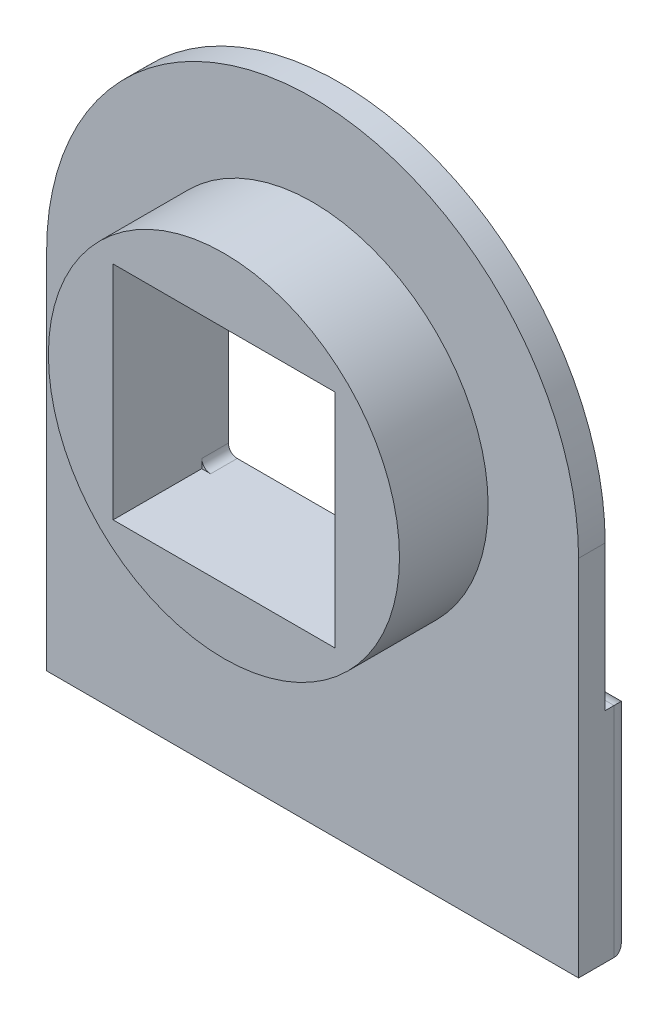
ISO-10303-21;
HEADER;
FILE_DESCRIPTION(('STEP AP214'),'2;1');
FILE_NAME('part.step','',(''),(''),'','','');
FILE_SCHEMA(('AUTOMOTIVE_DESIGN { 1 0 10303 214 1 1 1 1 }'));
ENDSEC;
DATA;
#1=APPLICATION_CONTEXT('core data for automotive mechanical design processes');
#2=APPLICATION_PROTOCOL_DEFINITION('international standard','automotive_design',2000,#1);
#3=PRODUCT_CONTEXT('',#1,'mechanical');
#4=PRODUCT('Part','Part','',(#3));
#5=PRODUCT_RELATED_PRODUCT_CATEGORY('part','',(#4));
#6=PRODUCT_DEFINITION_FORMATION('','',#4);
#7=PRODUCT_DEFINITION_CONTEXT('part definition',#1,'design');
#8=PRODUCT_DEFINITION('design','',#6,#7);
#9=PRODUCT_DEFINITION_SHAPE('','',#8);
#10=(LENGTH_UNIT() NAMED_UNIT(*) SI_UNIT(.MILLI.,.METRE.));
#11=(NAMED_UNIT(*) PLANE_ANGLE_UNIT() SI_UNIT($,.RADIAN.));
#12=(NAMED_UNIT(*) SI_UNIT($,.STERADIAN.) SOLID_ANGLE_UNIT());
#13=UNCERTAINTY_MEASURE_WITH_UNIT(LENGTH_MEASURE(1.E-05),#10,'distance_accuracy_value','');
#14=(GEOMETRIC_REPRESENTATION_CONTEXT(3) GLOBAL_UNCERTAINTY_ASSIGNED_CONTEXT((#13)) GLOBAL_UNIT_ASSIGNED_CONTEXT((#10,
#11,#12)) REPRESENTATION_CONTEXT('',''));
#15=CARTESIAN_POINT('',(0.,0.,0.));
#16=DIRECTION('',(0.,0.,1.));
#17=DIRECTION('',(1.,0.,0.));
#18=AXIS2_PLACEMENT_3D('',#15,#16,#17);
#19=CARTESIAN_POINT('',(0.,0.,0.));
#20=DIRECTION('',(0.,0.,1.));
#21=DIRECTION('',(1.,0.,0.));
#22=AXIS2_PLACEMENT_3D('',#19,#20,#21);
#23=PLANE('',#22);
#24=CARTESIAN_POINT('',(-20.3392574501485,-11.208047119268,0.));
#25=DIRECTION('',(0.,0.,1.));
#26=DIRECTION('',(1.,0.,0.));
#27=AXIS2_PLACEMENT_3D('',#24,#25,#26);
#28=CIRCLE('',#27,1.82171701222499);
#29=CARTESIAN_POINT('',(-18.5175404379235,-11.208047119268,0.));
#30=VERTEX_POINT('',#29);
#31=EDGE_CURVE('E204',#30,#30,#28,.T.);
#32=ORIENTED_EDGE('',*,*,#31,.T.);
#33=EDGE_LOOP('',(#32));
#34=FACE_BOUND('',#33,.T.);
#35=DIRECTION('',(1.,0.,0.));
#36=VECTOR('',#35,1.);
#37=CARTESIAN_POINT('',(0.,-12.5,0.));
#38=LINE('',#37,#36);
#39=CARTESIAN_POINT('',(-11.5,-12.5,0.));
#40=VERTEX_POINT('',#39);
#41=CARTESIAN_POINT('',(11.5,-12.5,0.));
#42=VERTEX_POINT('',#41);
#43=EDGE_CURVE('E299',#40,#42,#38,.T.);
#44=ORIENTED_EDGE('',*,*,#43,.T.);
#45=CARTESIAN_POINT('',(11.5,-11.5,0.));
#46=DIRECTION('',(0.,0.,-1.));
#47=DIRECTION('',(-1.,0.,0.));
#48=AXIS2_PLACEMENT_3D('',#45,#46,#47);
#49=CIRCLE('',#48,1.);
#50=CARTESIAN_POINT('',(12.5,-11.5,0.));
#51=VERTEX_POINT('',#50);
#52=EDGE_CURVE('E207',#42,#51,#49,.F.);
#53=ORIENTED_EDGE('',*,*,#52,.T.);
#54=DIRECTION('',(0.,1.,0.));
#55=VECTOR('',#54,1.);
#56=CARTESIAN_POINT('',(12.5,-12.5,0.));
#57=LINE('',#56,#55);
#58=CARTESIAN_POINT('',(12.5,11.5,0.));
#59=VERTEX_POINT('',#58);
#60=EDGE_CURVE('E302',#51,#59,#57,.T.);
#61=ORIENTED_EDGE('',*,*,#60,.T.);
#62=CARTESIAN_POINT('',(11.5,11.5,0.));
#63=DIRECTION('',(0.,0.,-1.));
#64=DIRECTION('',(-1.,0.,0.));
#65=AXIS2_PLACEMENT_3D('',#62,#63,#64);
#66=CIRCLE('',#65,0.999999999999999);
#67=CARTESIAN_POINT('',(11.5,12.5,0.));
#68=VERTEX_POINT('',#67);
#69=EDGE_CURVE('E232',#59,#68,#66,.F.);
#70=ORIENTED_EDGE('',*,*,#69,.T.);
#71=DIRECTION('',(-1.,0.,0.));
#72=VECTOR('',#71,1.);
#73=CARTESIAN_POINT('',(0.,12.5,0.));
#74=LINE('',#73,#72);
#75=CARTESIAN_POINT('',(-11.5,12.5,0.));
#76=VERTEX_POINT('',#75);
#77=EDGE_CURVE('E305',#68,#76,#74,.T.);
#78=ORIENTED_EDGE('',*,*,#77,.T.);
#79=CARTESIAN_POINT('',(-11.5,11.5,0.));
#80=DIRECTION('',(0.,0.,-1.));
#81=DIRECTION('',(-1.,0.,0.));
#82=AXIS2_PLACEMENT_3D('',#79,#80,#81);
#83=CIRCLE('',#82,1.);
#84=CARTESIAN_POINT('',(-12.5,11.5,0.));
#85=VERTEX_POINT('',#84);
#86=EDGE_CURVE('E234',#76,#85,#83,.F.);
#87=ORIENTED_EDGE('',*,*,#86,.T.);
#88=DIRECTION('',(0.,-1.,0.));
#89=VECTOR('',#88,1.);
#90=CARTESIAN_POINT('',(-12.5,12.5,0.));
#91=LINE('',#90,#89);
#92=CARTESIAN_POINT('',(-12.5,-11.5,0.));
#93=VERTEX_POINT('',#92);
#94=EDGE_CURVE('E291',#85,#93,#91,.T.);
#95=ORIENTED_EDGE('',*,*,#94,.T.);
#96=CARTESIAN_POINT('',(-11.5,-11.5,0.));
#97=DIRECTION('',(0.,0.,-1.));
#98=DIRECTION('',(-1.,0.,0.));
#99=AXIS2_PLACEMENT_3D('',#96,#97,#98);
#100=CIRCLE('',#99,0.999999999999999);
#101=EDGE_CURVE('E236',#40,#93,#100,.T.);
#102=ORIENTED_EDGE('',*,*,#101,.F.);
#103=EDGE_LOOP('',(#44,#53,#61,#70,#78,#87,#95,#102));
#104=FACE_BOUND('',#103,.T.);
#105=DIRECTION('',(1.,0.,0.));
#106=VECTOR('',#105,1.);
#107=CARTESIAN_POINT('',(30.,-16.3815795480247,0.));
#108=LINE('',#107,#106);
#109=CARTESIAN_POINT('',(-30.,-16.3815795480247,0.));
#110=VERTEX_POINT('',#109);
#111=CARTESIAN_POINT('',(30.,-16.3815795480247,0.));
#112=VERTEX_POINT('',#111);
#113=EDGE_CURVE('E188',#110,#112,#108,.T.);
#114=ORIENTED_EDGE('',*,*,#113,.F.);
#115=DIRECTION('',(0.,1.,0.));
#116=VECTOR('',#115,1.);
#117=CARTESIAN_POINT('',(-30.,0.,0.));
#118=LINE('',#117,#116);
#119=CARTESIAN_POINT('',(-30.,0.,0.));
#120=VERTEX_POINT('',#119);
#121=EDGE_CURVE('E196',#110,#120,#118,.T.);
#122=ORIENTED_EDGE('',*,*,#121,.T.);
#123=CARTESIAN_POINT('',(0.,0.,0.));
#124=DIRECTION('',(0.,0.,-1.));
#125=DIRECTION('',(-1.,0.,0.));
#126=AXIS2_PLACEMENT_3D('',#123,#124,#125);
#127=CIRCLE('',#126,30.);
#128=CARTESIAN_POINT('',(30.,0.,0.));
#129=VERTEX_POINT('',#128);
#130=EDGE_CURVE('E195',#120,#129,#127,.T.);
#131=ORIENTED_EDGE('',*,*,#130,.T.);
#132=DIRECTION('',(0.,1.,0.));
#133=VECTOR('',#132,1.);
#134=CARTESIAN_POINT('',(30.,0.,0.));
#135=LINE('',#134,#133);
#136=EDGE_CURVE('E180',#112,#129,#135,.T.);
#137=ORIENTED_EDGE('',*,*,#136,.F.);
#138=EDGE_LOOP('',(#114,#122,#131,#137));
#139=FACE_BOUND('',#138,.T.);
#140=ADVANCED_FACE('F39',(#34,#104,#139),#23,.F.);
#141=CARTESIAN_POINT('',(0.,0.,13.));
#142=DIRECTION('',(0.,0.,-1.));
#143=DIRECTION('',(-1.,0.,0.));
#144=AXIS2_PLACEMENT_3D('',#141,#142,#143);
#145=CYLINDRICAL_SURFACE('',#144,19.8);
#146=CARTESIAN_POINT('',(0.,0.,13.));
#147=DIRECTION('',(0.,0.,1.));
#148=DIRECTION('',(1.,0.,0.));
#149=AXIS2_PLACEMENT_3D('',#146,#147,#148);
#150=CIRCLE('',#149,19.8);
#151=CARTESIAN_POINT('',(-19.8,0.,13.));
#152=VERTEX_POINT('',#151);
#153=EDGE_CURVE('E321',#152,#152,#150,.T.);
#154=CARTESIAN_POINT('',(0.,0.,3.));
#155=DIRECTION('',(0.,0.,-1.));
#156=DIRECTION('',(-1.,0.,0.));
#157=AXIS2_PLACEMENT_3D('',#154,#155,#156);
#158=CIRCLE('',#157,19.8);
#159=CARTESIAN_POINT('',(-19.8,0.,3.));
#160=VERTEX_POINT('',#159);
#161=EDGE_CURVE('E283',#160,#160,#158,.T.);
#162=CARTESIAN_POINT('',(-19.8,0.,13.));
#163=CARTESIAN_POINT('',(-19.8,0.,12.8958333333333));
#164=CARTESIAN_POINT('',(-19.8,0.,12.7916666666667));
#165=CARTESIAN_POINT('',(-19.8,0.,12.5833333333333));
#166=CARTESIAN_POINT('',(-19.8,0.,12.4791666666667));
#167=CARTESIAN_POINT('',(-19.8,0.,12.2708333333333));
#168=CARTESIAN_POINT('',(-19.8,0.,12.1666666666667));
#169=CARTESIAN_POINT('',(-19.8,0.,11.9583333333333));
#170=CARTESIAN_POINT('',(-19.8,0.,11.8541666666667));
#171=CARTESIAN_POINT('',(-19.8,0.,11.6458333333333));
#172=CARTESIAN_POINT('',(-19.8,0.,11.5416666666667));
#173=CARTESIAN_POINT('',(-19.8,0.,11.3333333333333));
#174=CARTESIAN_POINT('',(-19.8,0.,11.2291666666667));
#175=CARTESIAN_POINT('',(-19.8,0.,11.0208333333333));
#176=CARTESIAN_POINT('',(-19.8,0.,10.9166666666667));
#177=CARTESIAN_POINT('',(-19.8,0.,10.7083333333333));
#178=CARTESIAN_POINT('',(-19.8,0.,10.6041666666667));
#179=CARTESIAN_POINT('',(-19.8,0.,10.3958333333333));
#180=CARTESIAN_POINT('',(-19.8,0.,10.2916666666667));
#181=CARTESIAN_POINT('',(-19.8,0.,10.0833333333333));
#182=CARTESIAN_POINT('',(-19.8,0.,9.97916666666667));
#183=CARTESIAN_POINT('',(-19.8,0.,9.77083333333333));
#184=CARTESIAN_POINT('',(-19.8,0.,9.66666666666667));
#185=CARTESIAN_POINT('',(-19.8,0.,9.45833333333333));
#186=CARTESIAN_POINT('',(-19.8,0.,9.35416666666667));
#187=CARTESIAN_POINT('',(-19.8,0.,9.14583333333333));
#188=CARTESIAN_POINT('',(-19.8,0.,9.04166666666667));
#189=CARTESIAN_POINT('',(-19.8,0.,8.83333333333333));
#190=CARTESIAN_POINT('',(-19.8,0.,8.72916666666667));
#191=CARTESIAN_POINT('',(-19.8,0.,8.52083333333333));
#192=CARTESIAN_POINT('',(-19.8,0.,8.41666666666667));
#193=CARTESIAN_POINT('',(-19.8,0.,8.20833333333333));
#194=CARTESIAN_POINT('',(-19.8,0.,8.10416666666667));
#195=CARTESIAN_POINT('',(-19.8,0.,7.89583333333333));
#196=CARTESIAN_POINT('',(-19.8,0.,7.79166666666667));
#197=CARTESIAN_POINT('',(-19.8,0.,7.58333333333333));
#198=CARTESIAN_POINT('',(-19.8,0.,7.47916666666667));
#199=CARTESIAN_POINT('',(-19.8,0.,7.27083333333333));
#200=CARTESIAN_POINT('',(-19.8,0.,7.16666666666667));
#201=CARTESIAN_POINT('',(-19.8,0.,6.95833333333333));
#202=CARTESIAN_POINT('',(-19.8,0.,6.85416666666667));
#203=CARTESIAN_POINT('',(-19.8,0.,6.64583333333333));
#204=CARTESIAN_POINT('',(-19.8,0.,6.54166666666667));
#205=CARTESIAN_POINT('',(-19.8,0.,6.33333333333333));
#206=CARTESIAN_POINT('',(-19.8,0.,6.22916666666667));
#207=CARTESIAN_POINT('',(-19.8,0.,6.02083333333333));
#208=CARTESIAN_POINT('',(-19.8,0.,5.91666666666667));
#209=CARTESIAN_POINT('',(-19.8,0.,5.70833333333333));
#210=CARTESIAN_POINT('',(-19.8,0.,5.60416666666667));
#211=CARTESIAN_POINT('',(-19.8,0.,5.39583333333333));
#212=CARTESIAN_POINT('',(-19.8,0.,5.29166666666667));
#213=CARTESIAN_POINT('',(-19.8,0.,5.08333333333333));
#214=CARTESIAN_POINT('',(-19.8,0.,4.97916666666667));
#215=CARTESIAN_POINT('',(-19.8,0.,4.77083333333334));
#216=CARTESIAN_POINT('',(-19.8,0.,4.66666666666667));
#217=CARTESIAN_POINT('',(-19.8,0.,4.45833333333334));
#218=CARTESIAN_POINT('',(-19.8,0.,4.35416666666667));
#219=CARTESIAN_POINT('',(-19.8,0.,4.14583333333334));
#220=CARTESIAN_POINT('',(-19.8,0.,4.04166666666667));
#221=CARTESIAN_POINT('',(-19.8,0.,3.83333333333334));
#222=CARTESIAN_POINT('',(-19.8,0.,3.72916666666667));
#223=CARTESIAN_POINT('',(-19.8,0.,3.52083333333334));
#224=CARTESIAN_POINT('',(-19.8,0.,3.41666666666667));
#225=CARTESIAN_POINT('',(-19.8,0.,3.20833333333334));
#226=CARTESIAN_POINT('',(-19.8,0.,3.10416666666667));
#227=CARTESIAN_POINT('',(-19.8,0.,3.));
#228=B_SPLINE_CURVE_WITH_KNOTS('',3,(#162,#163,#164,#165,#166,#167,#168,#169,#170,#171,#172,
#173,#174,#175,#176,#177,#178,#179,#180,#181,#182,#183,#184,#185,#186,#187,#188,#189,#190,#191,
#192,#193,#194,#195,#196,#197,#198,#199,#200,#201,#202,#203,#204,#205,#206,#207,#208,#209,#210,
#211,#212,#213,#214,#215,#216,#217,#218,#219,#220,#221,#222,#223,#224,#225,#226,#227),
.UNSPECIFIED.,.F.,.F.,(4,2,2,2,2,2,2,2,2,2,2,2,2,2,2,2,2,2,2,2,2,2,2,2,2,2,2,2,2,2,2,2,4),(0.,
0.3125,0.625000000000001,0.937500000000001,1.25,1.5625,1.875,2.1875,2.5,2.8125,3.125,3.4375,
3.75,4.0625,4.375,4.6875,5.,5.3125,5.625,5.9375,6.25,6.5625,6.875,7.1875,7.5,7.8125,8.125,
8.4375,8.75,9.0625,9.375,9.6875,10.),.UNSPECIFIED.);
#229=EDGE_CURVE('BSEAM379',#152,#160,#228,.T.);
#230=ORIENTED_EDGE('',*,*,#153,.F.);
#231=ORIENTED_EDGE('',*,*,#161,.F.);
#232=ORIENTED_EDGE('',*,*,#229,.T.);
#233=ORIENTED_EDGE('',*,*,#229,.F.);
#234=EDGE_LOOP('',(#230,#232,#231,#233));
#235=FACE_BOUND('',#234,.T.);
#236=ADVANCED_FACE('F379',(#235),#145,.T.);
#237=CARTESIAN_POINT('',(12.5,-12.5,13.));
#238=DIRECTION('',(-1.,0.,0.));
#239=DIRECTION('',(0.,0.,1.));
#240=AXIS2_PLACEMENT_3D('',#237,#238,#239);
#241=PLANE('',#240);
#242=DIRECTION('',(0.,0.,-1.));
#243=VECTOR('',#242,1.);
#244=CARTESIAN_POINT('',(12.5,12.5,13.));
#245=LINE('',#244,#243);
#246=CARTESIAN_POINT('',(12.5,12.5,13.));
#247=VERTEX_POINT('',#246);
#248=CARTESIAN_POINT('',(12.5,12.5,3.));
#249=VERTEX_POINT('',#248);
#250=EDGE_CURVE('E315',#247,#249,#245,.T.);
#251=ORIENTED_EDGE('',*,*,#250,.T.);
#252=DIRECTION('',(0.,-1.,0.));
#253=VECTOR('',#252,1.);
#254=CARTESIAN_POINT('',(12.5,-12.5,3.));
#255=LINE('',#254,#253);
#256=CARTESIAN_POINT('',(12.5,11.5,3.));
#257=VERTEX_POINT('',#256);
#258=EDGE_CURVE('E279',#249,#257,#255,.T.);
#259=ORIENTED_EDGE('',*,*,#258,.T.);
#260=DIRECTION('',(0.,0.,-1.));
#261=VECTOR('',#260,1.);
#262=CARTESIAN_POINT('',(12.5,11.5,3.));
#263=LINE('',#262,#261);
#264=EDGE_CURVE('E267',#257,#59,#263,.T.);
#265=ORIENTED_EDGE('',*,*,#264,.T.);
#266=ORIENTED_EDGE('',*,*,#60,.F.);
#267=DIRECTION('',(0.,0.,-1.));
#268=VECTOR('',#267,1.);
#269=CARTESIAN_POINT('',(12.5,-11.5,3.));
#270=LINE('',#269,#268);
#271=CARTESIAN_POINT('',(12.5,-11.5,3.));
#272=VERTEX_POINT('',#271);
#273=EDGE_CURVE('E230',#272,#51,#270,.T.);
#274=ORIENTED_EDGE('',*,*,#273,.F.);
#275=CARTESIAN_POINT('',(12.5,-12.5,3.));
#276=VERTEX_POINT('',#275);
#277=EDGE_CURVE('E282',#272,#276,#255,.T.);
#278=ORIENTED_EDGE('',*,*,#277,.T.);
#279=DIRECTION('',(0.,0.,-1.));
#280=VECTOR('',#279,1.);
#281=CARTESIAN_POINT('',(12.5,-12.5,13.));
#282=LINE('',#281,#280);
#283=CARTESIAN_POINT('',(12.5,-12.5,13.));
#284=VERTEX_POINT('',#283);
#285=EDGE_CURVE('E318',#284,#276,#282,.T.);
#286=ORIENTED_EDGE('',*,*,#285,.F.);
#287=DIRECTION('',(0.,1.,0.));
#288=VECTOR('',#287,1.);
#289=CARTESIAN_POINT('',(12.5,-12.5,13.));
#290=LINE('',#289,#288);
#291=EDGE_CURVE('E290',#284,#247,#290,.T.);
#292=ORIENTED_EDGE('',*,*,#291,.T.);
#293=EDGE_LOOP('',(#251,#259,#265,#266,#274,#278,#286,#292));
#294=FACE_BOUND('',#293,.T.);
#295=ADVANCED_FACE('F385',(#294),#241,.T.);
#296=CARTESIAN_POINT('',(0.,12.5,13.));
#297=DIRECTION('',(0.,-1.,0.));
#298=DIRECTION('',(1.,0.,0.));
#299=AXIS2_PLACEMENT_3D('',#296,#297,#298);
#300=PLANE('',#299);
#301=DIRECTION('',(0.,0.,-1.));
#302=VECTOR('',#301,1.);
#303=CARTESIAN_POINT('',(-12.5,12.5,13.));
#304=LINE('',#303,#302);
#305=CARTESIAN_POINT('',(-12.5,12.5,13.));
#306=VERTEX_POINT('',#305);
#307=CARTESIAN_POINT('',(-12.5,12.5,3.));
#308=VERTEX_POINT('',#307);
#309=EDGE_CURVE('E312',#306,#308,#304,.T.);
#310=ORIENTED_EDGE('',*,*,#309,.T.);
#311=DIRECTION('',(1.,0.,0.));
#312=VECTOR('',#311,1.);
#313=CARTESIAN_POINT('',(0.,12.5,3.));
#314=LINE('',#313,#312);
#315=CARTESIAN_POINT('',(-11.5,12.5,3.));
#316=VERTEX_POINT('',#315);
#317=EDGE_CURVE('E243',#308,#316,#314,.T.);
#318=ORIENTED_EDGE('',*,*,#317,.T.);
#319=DIRECTION('',(0.,0.,-1.));
#320=VECTOR('',#319,1.);
#321=CARTESIAN_POINT('',(-11.5,12.5,3.));
#322=LINE('',#321,#320);
#323=EDGE_CURVE('E261',#316,#76,#322,.T.);
#324=ORIENTED_EDGE('',*,*,#323,.T.);
#325=ORIENTED_EDGE('',*,*,#77,.F.);
#326=DIRECTION('',(0.,0.,-1.));
#327=VECTOR('',#326,1.);
#328=CARTESIAN_POINT('',(11.5,12.5,3.));
#329=LINE('',#328,#327);
#330=CARTESIAN_POINT('',(11.5,12.5,3.));
#331=VERTEX_POINT('',#330);
#332=EDGE_CURVE('E264',#331,#68,#329,.T.);
#333=ORIENTED_EDGE('',*,*,#332,.F.);
#334=EDGE_CURVE('E275',#331,#249,#314,.T.);
#335=ORIENTED_EDGE('',*,*,#334,.T.);
#336=ORIENTED_EDGE('',*,*,#250,.F.);
#337=DIRECTION('',(-1.,0.,0.));
#338=VECTOR('',#337,1.);
#339=CARTESIAN_POINT('',(12.5,12.5,13.));
#340=LINE('',#339,#338);
#341=EDGE_CURVE('E293',#247,#306,#340,.T.);
#342=ORIENTED_EDGE('',*,*,#341,.T.);
#343=EDGE_LOOP('',(#310,#318,#324,#325,#333,#335,#336,#342));
#344=FACE_BOUND('',#343,.T.);
#345=ADVANCED_FACE('F471',(#344),#300,.T.);
#346=CARTESIAN_POINT('',(-12.5,12.5,13.));
#347=DIRECTION('',(1.,0.,0.));
#348=DIRECTION('',(0.,0.,-1.));
#349=AXIS2_PLACEMENT_3D('',#346,#347,#348);
#350=PLANE('',#349);
#351=DIRECTION('',(0.,0.,-1.));
#352=VECTOR('',#351,1.);
#353=CARTESIAN_POINT('',(-12.5,-12.5,13.));
#354=LINE('',#353,#352);
#355=CARTESIAN_POINT('',(-12.5,-12.5,13.));
#356=VERTEX_POINT('',#355);
#357=CARTESIAN_POINT('',(-12.5,-12.5,3.));
#358=VERTEX_POINT('',#357);
#359=EDGE_CURVE('E298',#356,#358,#354,.T.);
#360=ORIENTED_EDGE('',*,*,#359,.T.);
#361=DIRECTION('',(0.,1.,0.));
#362=VECTOR('',#361,1.);
#363=CARTESIAN_POINT('',(-12.5,12.5,3.));
#364=LINE('',#363,#362);
#365=CARTESIAN_POINT('',(-12.5,-11.5,3.));
#366=VERTEX_POINT('',#365);
#367=EDGE_CURVE('E287',#358,#366,#364,.T.);
#368=ORIENTED_EDGE('',*,*,#367,.T.);
#369=DIRECTION('',(0.,0.,-1.));
#370=VECTOR('',#369,1.);
#371=CARTESIAN_POINT('',(-12.5,-11.5,3.));
#372=LINE('',#371,#370);
#373=EDGE_CURVE('E255',#366,#93,#372,.T.);
#374=ORIENTED_EDGE('',*,*,#373,.T.);
#375=ORIENTED_EDGE('',*,*,#94,.F.);
#376=DIRECTION('',(0.,0.,-1.));
#377=VECTOR('',#376,1.);
#378=CARTESIAN_POINT('',(-12.5,11.5,3.));
#379=LINE('',#378,#377);
#380=CARTESIAN_POINT('',(-12.5,11.5,3.));
#381=VERTEX_POINT('',#380);
#382=EDGE_CURVE('E258',#381,#85,#379,.T.);
#383=ORIENTED_EDGE('',*,*,#382,.F.);
#384=EDGE_CURVE('E324',#381,#308,#364,.T.);
#385=ORIENTED_EDGE('',*,*,#384,.T.);
#386=ORIENTED_EDGE('',*,*,#309,.F.);
#387=DIRECTION('',(0.,-1.,0.));
#388=VECTOR('',#387,1.);
#389=CARTESIAN_POINT('',(-12.5,12.5,13.));
#390=LINE('',#389,#388);
#391=EDGE_CURVE('E296',#306,#356,#390,.T.);
#392=ORIENTED_EDGE('',*,*,#391,.T.);
#393=EDGE_LOOP('',(#360,#368,#374,#375,#383,#385,#386,#392));
#394=FACE_BOUND('',#393,.T.);
#395=ADVANCED_FACE('F483',(#394),#350,.T.);
#396=CARTESIAN_POINT('',(0.,0.,13.));
#397=DIRECTION('',(0.,0.,1.));
#398=DIRECTION('',(1.,0.,0.));
#399=AXIS2_PLACEMENT_3D('',#396,#397,#398);
#400=PLANE('',#399);
#401=ORIENTED_EDGE('',*,*,#153,.T.);
#402=EDGE_LOOP('',(#401));
#403=FACE_BOUND('',#402,.T.);
#404=ORIENTED_EDGE('',*,*,#291,.F.);
#405=DIRECTION('',(1.,0.,0.));
#406=VECTOR('',#405,1.);
#407=CARTESIAN_POINT('',(-12.5,-12.5,13.));
#408=LINE('',#407,#406);
#409=EDGE_CURVE('E288',#356,#284,#408,.T.);
#410=ORIENTED_EDGE('',*,*,#409,.F.);
#411=ORIENTED_EDGE('',*,*,#391,.F.);
#412=ORIENTED_EDGE('',*,*,#341,.F.);
#413=EDGE_LOOP('',(#404,#410,#411,#412));
#414=FACE_BOUND('',#413,.T.);
#415=ADVANCED_FACE('F391',(#403,#414),#400,.T.);
#416=CARTESIAN_POINT('',(0.,-12.5,13.));
#417=DIRECTION('',(0.,1.,0.));
#418=DIRECTION('',(0.,0.,1.));
#419=AXIS2_PLACEMENT_3D('',#416,#417,#418);
#420=PLANE('',#419);
#421=DIRECTION('',(0.,0.,-1.));
#422=VECTOR('',#421,1.);
#423=CARTESIAN_POINT('',(11.5,-12.5,3.));
#424=LINE('',#423,#422);
#425=CARTESIAN_POINT('',(11.5,-12.5,3.));
#426=VERTEX_POINT('',#425);
#427=EDGE_CURVE('E250',#426,#42,#424,.T.);
#428=ORIENTED_EDGE('',*,*,#427,.T.);
#429=ORIENTED_EDGE('',*,*,#43,.F.);
#430=DIRECTION('',(0.,0.,-1.));
#431=VECTOR('',#430,1.);
#432=CARTESIAN_POINT('',(-11.5,-12.5,3.));
#433=LINE('',#432,#431);
#434=CARTESIAN_POINT('',(-11.5,-12.5,3.));
#435=VERTEX_POINT('',#434);
#436=EDGE_CURVE('E253',#435,#40,#433,.T.);
#437=ORIENTED_EDGE('',*,*,#436,.F.);
#438=DIRECTION('',(-1.,0.,0.));
#439=VECTOR('',#438,1.);
#440=CARTESIAN_POINT('',(0.,-12.5,3.));
#441=LINE('',#440,#439);
#442=EDGE_CURVE('E274',#435,#358,#441,.T.);
#443=ORIENTED_EDGE('',*,*,#442,.T.);
#444=ORIENTED_EDGE('',*,*,#359,.F.);
#445=ORIENTED_EDGE('',*,*,#409,.T.);
#446=ORIENTED_EDGE('',*,*,#285,.T.);
#447=EDGE_CURVE('E278',#276,#426,#441,.T.);
#448=ORIENTED_EDGE('',*,*,#447,.T.);
#449=EDGE_LOOP('',(#428,#429,#437,#443,#444,#445,#446,#448));
#450=FACE_BOUND('',#449,.T.);
#451=ADVANCED_FACE('F417',(#450),#420,.T.);
#452=CARTESIAN_POINT('',(0.,0.,3.));
#453=DIRECTION('',(0.,0.,-1.));
#454=DIRECTION('',(-1.,0.,0.));
#455=AXIS2_PLACEMENT_3D('',#452,#453,#454);
#456=PLANE('',#455);
#457=ORIENTED_EDGE('',*,*,#317,.F.);
#458=ORIENTED_EDGE('',*,*,#384,.F.);
#459=CARTESIAN_POINT('',(-11.5,11.5,3.));
#460=DIRECTION('',(0.,0.,-1.));
#461=DIRECTION('',(-1.,0.,0.));
#462=AXIS2_PLACEMENT_3D('',#459,#460,#461);
#463=CIRCLE('',#462,1.);
#464=EDGE_CURVE('E214',#316,#381,#463,.F.);
#465=ORIENTED_EDGE('',*,*,#464,.F.);
#466=EDGE_LOOP('',(#457,#458,#465));
#467=FACE_BOUND('',#466,.T.);
#468=ADVANCED_FACE('F414',(#467),#456,.F.);
#469=CARTESIAN_POINT('',(-11.5,11.5,3.));
#470=DIRECTION('',(0.,0.,-1.));
#471=DIRECTION('',(-1.,0.,0.));
#472=AXIS2_PLACEMENT_3D('',#469,#470,#471);
#473=CYLINDRICAL_SURFACE('',#472,1.);
#474=ORIENTED_EDGE('',*,*,#86,.F.);
#475=ORIENTED_EDGE('',*,*,#323,.F.);
#476=ORIENTED_EDGE('',*,*,#464,.T.);
#477=ORIENTED_EDGE('',*,*,#382,.T.);
#478=EDGE_LOOP('',(#474,#475,#476,#477));
#479=FACE_BOUND('',#478,.T.);
#480=ADVANCED_FACE('F416',(#479),#473,.F.);
#481=ORIENTED_EDGE('',*,*,#442,.F.);
#482=CARTESIAN_POINT('',(-11.5,-11.5,3.));
#483=DIRECTION('',(0.,0.,-1.));
#484=DIRECTION('',(-1.,0.,0.));
#485=AXIS2_PLACEMENT_3D('',#482,#483,#484);
#486=CIRCLE('',#485,0.999999999999999);
#487=EDGE_CURVE('E217',#435,#366,#486,.T.);
#488=ORIENTED_EDGE('',*,*,#487,.T.);
#489=ORIENTED_EDGE('',*,*,#367,.F.);
#490=EDGE_LOOP('',(#481,#488,#489));
#491=FACE_BOUND('',#490,.T.);
#492=ADVANCED_FACE('F419',(#491),#456,.F.);
#493=CARTESIAN_POINT('',(-11.5,-11.5,3.));
#494=DIRECTION('',(0.,0.,-1.));
#495=DIRECTION('',(-1.,0.,0.));
#496=AXIS2_PLACEMENT_3D('',#493,#494,#495);
#497=CYLINDRICAL_SURFACE('',#496,0.999999999999999);
#498=ORIENTED_EDGE('',*,*,#101,.T.);
#499=ORIENTED_EDGE('',*,*,#373,.F.);
#500=ORIENTED_EDGE('',*,*,#487,.F.);
#501=ORIENTED_EDGE('',*,*,#436,.T.);
#502=EDGE_LOOP('',(#498,#499,#500,#501));
#503=FACE_BOUND('',#502,.T.);
#504=ADVANCED_FACE('F432',(#503),#497,.F.);
#505=ORIENTED_EDGE('',*,*,#258,.F.);
#506=ORIENTED_EDGE('',*,*,#334,.F.);
#507=CARTESIAN_POINT('',(11.5,11.5,3.));
#508=DIRECTION('',(0.,0.,-1.));
#509=DIRECTION('',(-1.,0.,0.));
#510=AXIS2_PLACEMENT_3D('',#507,#508,#509);
#511=CIRCLE('',#510,0.999999999999999);
#512=EDGE_CURVE('E211',#257,#331,#511,.F.);
#513=ORIENTED_EDGE('',*,*,#512,.F.);
#514=EDGE_LOOP('',(#505,#506,#513));
#515=FACE_BOUND('',#514,.T.);
#516=ADVANCED_FACE('F434',(#515),#456,.F.);
#517=CARTESIAN_POINT('',(11.5,11.5,3.));
#518=DIRECTION('',(0.,0.,-1.));
#519=DIRECTION('',(-1.,0.,0.));
#520=AXIS2_PLACEMENT_3D('',#517,#518,#519);
#521=CYLINDRICAL_SURFACE('',#520,0.999999999999999);
#522=ORIENTED_EDGE('',*,*,#69,.F.);
#523=ORIENTED_EDGE('',*,*,#264,.F.);
#524=ORIENTED_EDGE('',*,*,#512,.T.);
#525=ORIENTED_EDGE('',*,*,#332,.T.);
#526=EDGE_LOOP('',(#522,#523,#524,#525));
#527=FACE_BOUND('',#526,.T.);
#528=ADVANCED_FACE('F441',(#527),#521,.F.);
#529=ORIENTED_EDGE('',*,*,#447,.F.);
#530=ORIENTED_EDGE('',*,*,#277,.F.);
#531=CARTESIAN_POINT('',(11.5,-11.5,3.));
#532=DIRECTION('',(0.,0.,-1.));
#533=DIRECTION('',(-1.,0.,0.));
#534=AXIS2_PLACEMENT_3D('',#531,#532,#533);
#535=CIRCLE('',#534,1.);
#536=EDGE_CURVE('E208',#426,#272,#535,.F.);
#537=ORIENTED_EDGE('',*,*,#536,.F.);
#538=EDGE_LOOP('',(#529,#530,#537));
#539=FACE_BOUND('',#538,.T.);
#540=ADVANCED_FACE('F430',(#539),#456,.F.);
#541=CARTESIAN_POINT('',(11.5,-11.5,3.));
#542=DIRECTION('',(0.,0.,-1.));
#543=DIRECTION('',(-1.,0.,0.));
#544=AXIS2_PLACEMENT_3D('',#541,#542,#543);
#545=CYLINDRICAL_SURFACE('',#544,1.);
#546=ORIENTED_EDGE('',*,*,#52,.F.);
#547=ORIENTED_EDGE('',*,*,#427,.F.);
#548=ORIENTED_EDGE('',*,*,#536,.T.);
#549=ORIENTED_EDGE('',*,*,#273,.T.);
#550=EDGE_LOOP('',(#546,#547,#548,#549));
#551=FACE_BOUND('',#550,.T.);
#552=ADVANCED_FACE('F428',(#551),#545,.F.);
#553=CARTESIAN_POINT('',(-20.3392574501485,-11.208047119268,3.));
#554=DIRECTION('',(0.,0.,-1.));
#555=DIRECTION('',(-1.,0.,0.));
#556=AXIS2_PLACEMENT_3D('',#553,#554,#555);
#557=CIRCLE('',#556,1.82171701222499);
#558=CARTESIAN_POINT('',(-22.1609744623735,-11.208047119268,3.));
#559=VERTEX_POINT('',#558);
#560=EDGE_CURVE('E43',#559,#559,#557,.T.);
#561=ORIENTED_EDGE('',*,*,#560,.T.);
#562=EDGE_LOOP('',(#561));
#563=FACE_BOUND('',#562,.T.);
#564=CARTESIAN_POINT('',(0.,0.,3.));
#565=DIRECTION('',(0.,0.,-1.));
#566=DIRECTION('',(-1.,0.,0.));
#567=AXIS2_PLACEMENT_3D('',#564,#565,#566);
#568=CIRCLE('',#567,30.);
#569=CARTESIAN_POINT('',(-30.,0.,3.));
#570=VERTEX_POINT('',#569);
#571=CARTESIAN_POINT('',(30.,0.,3.));
#572=VERTEX_POINT('',#571);
#573=EDGE_CURVE('E219',#570,#572,#568,.T.);
#574=ORIENTED_EDGE('',*,*,#573,.F.);
#575=DIRECTION('',(0.,1.,0.));
#576=VECTOR('',#575,1.);
#577=CARTESIAN_POINT('',(-30.,0.,3.));
#578=LINE('',#577,#576);
#579=CARTESIAN_POINT('',(-30.,-41.,3.));
#580=VERTEX_POINT('',#579);
#581=EDGE_CURVE('E227',#580,#570,#578,.T.);
#582=ORIENTED_EDGE('',*,*,#581,.F.);
#583=DIRECTION('',(-1.,0.,0.));
#584=VECTOR('',#583,1.);
#585=CARTESIAN_POINT('',(0.,-41.,3.));
#586=LINE('',#585,#584);
#587=CARTESIAN_POINT('',(30.,-41.,3.));
#588=VERTEX_POINT('',#587);
#589=EDGE_CURVE('E224',#588,#580,#586,.T.);
#590=ORIENTED_EDGE('',*,*,#589,.F.);
#591=DIRECTION('',(0.,1.,0.));
#592=VECTOR('',#591,1.);
#593=CARTESIAN_POINT('',(30.,0.,3.));
#594=LINE('',#593,#592);
#595=EDGE_CURVE('E222',#588,#572,#594,.T.);
#596=ORIENTED_EDGE('',*,*,#595,.T.);
#597=EDGE_LOOP('',(#574,#582,#590,#596));
#598=FACE_BOUND('',#597,.T.);
#599=ORIENTED_EDGE('',*,*,#161,.T.);
#600=EDGE_LOOP('',(#599));
#601=FACE_BOUND('',#600,.T.);
#602=ADVANCED_FACE('F367',(#563,#598,#601),#456,.F.);
#603=CARTESIAN_POINT('',(0.,0.,3.));
#604=DIRECTION('',(0.,0.,-1.));
#605=DIRECTION('',(-1.,0.,0.));
#606=AXIS2_PLACEMENT_3D('',#603,#604,#605);
#607=CYLINDRICAL_SURFACE('',#606,30.);
#608=ORIENTED_EDGE('',*,*,#130,.F.);
#609=DIRECTION('',(0.,0.,-1.));
#610=VECTOR('',#609,1.);
#611=CARTESIAN_POINT('',(-30.,0.,3.));
#612=LINE('',#611,#610);
#613=EDGE_CURVE('E240',#570,#120,#612,.T.);
#614=ORIENTED_EDGE('',*,*,#613,.F.);
#615=ORIENTED_EDGE('',*,*,#573,.T.);
#616=DIRECTION('',(0.,0.,-1.));
#617=VECTOR('',#616,1.);
#618=CARTESIAN_POINT('',(30.,0.,3.));
#619=LINE('',#618,#617);
#620=EDGE_CURVE('E248',#572,#129,#619,.T.);
#621=ORIENTED_EDGE('',*,*,#620,.T.);
#622=EDGE_LOOP('',(#608,#614,#615,#621));
#623=FACE_BOUND('',#622,.T.);
#624=ADVANCED_FACE('F363',(#623),#607,.T.);
#625=CARTESIAN_POINT('',(-30.,0.,3.));
#626=DIRECTION('',(-1.,0.,0.));
#627=DIRECTION('',(0.,0.,1.));
#628=AXIS2_PLACEMENT_3D('',#625,#626,#627);
#629=PLANE('',#628);
#630=DIRECTION('',(0.,0.,1.));
#631=VECTOR('',#630,1.);
#632=CARTESIAN_POINT('',(-30.,-16.3815795480247,-3.));
#633=LINE('',#632,#631);
#634=CARTESIAN_POINT('',(-30.,-16.3815795480247,-1.));
#635=VERTEX_POINT('',#634);
#636=EDGE_CURVE('E187',#635,#110,#633,.T.);
#637=ORIENTED_EDGE('',*,*,#636,.F.);
#638=DIRECTION('',(0.,1.,0.));
#639=VECTOR('',#638,1.);
#640=CARTESIAN_POINT('',(-30.,0.,-1.));
#641=LINE('',#640,#639);
#642=CARTESIAN_POINT('',(-30.,-41.,-1.));
#643=VERTEX_POINT('',#642);
#644=EDGE_CURVE('E63',#635,#643,#641,.F.);
#645=ORIENTED_EDGE('',*,*,#644,.T.);
#646=DIRECTION('',(0.,0.,-1.));
#647=VECTOR('',#646,1.);
#648=CARTESIAN_POINT('',(-30.,-41.,3.));
#649=LINE('',#648,#647);
#650=EDGE_CURVE('E244',#580,#643,#649,.T.);
#651=ORIENTED_EDGE('',*,*,#650,.F.);
#652=ORIENTED_EDGE('',*,*,#581,.T.);
#653=ORIENTED_EDGE('',*,*,#613,.T.);
#654=ORIENTED_EDGE('',*,*,#121,.F.);
#655=EDGE_LOOP('',(#637,#645,#651,#652,#653,#654));
#656=FACE_BOUND('',#655,.T.);
#657=ADVANCED_FACE('F359',(#656),#629,.T.);
#658=CARTESIAN_POINT('',(0.,-41.,3.));
#659=DIRECTION('',(0.,-1.,0.));
#660=DIRECTION('',(0.,0.,-1.));
#661=AXIS2_PLACEMENT_3D('',#658,#659,#660);
#662=PLANE('',#661);
#663=ORIENTED_EDGE('',*,*,#650,.T.);
#664=DIRECTION('',(-1.,0.,0.));
#665=VECTOR('',#664,1.);
#666=CARTESIAN_POINT('',(0.,-41.,-1.));
#667=LINE('',#666,#665);
#668=CARTESIAN_POINT('',(30.,-41.,-1.));
#669=VERTEX_POINT('',#668);
#670=EDGE_CURVE('E48',#643,#669,#667,.F.);
#671=ORIENTED_EDGE('',*,*,#670,.T.);
#672=DIRECTION('',(0.,0.,-1.));
#673=VECTOR('',#672,1.);
#674=CARTESIAN_POINT('',(30.,-41.,3.));
#675=LINE('',#674,#673);
#676=EDGE_CURVE('E246',#588,#669,#675,.T.);
#677=ORIENTED_EDGE('',*,*,#676,.F.);
#678=ORIENTED_EDGE('',*,*,#589,.T.);
#679=EDGE_LOOP('',(#663,#671,#677,#678));
#680=FACE_BOUND('',#679,.T.);
#681=ADVANCED_FACE('F369',(#680),#662,.T.);
#682=CARTESIAN_POINT('',(30.,0.,3.));
#683=DIRECTION('',(-1.,0.,0.));
#684=DIRECTION('',(0.,0.,1.));
#685=AXIS2_PLACEMENT_3D('',#682,#683,#684);
#686=PLANE('',#685);
#687=ORIENTED_EDGE('',*,*,#676,.T.);
#688=DIRECTION('',(0.,-1.,0.));
#689=VECTOR('',#688,1.);
#690=CARTESIAN_POINT('',(30.,-16.3815795480247,-1.));
#691=LINE('',#690,#689);
#692=CARTESIAN_POINT('',(30.,-16.3815795480247,-1.));
#693=VERTEX_POINT('',#692);
#694=EDGE_CURVE('E11',#669,#693,#691,.F.);
#695=ORIENTED_EDGE('',*,*,#694,.T.);
#696=DIRECTION('',(0.,0.,1.));
#697=VECTOR('',#696,1.);
#698=CARTESIAN_POINT('',(30.,-16.3815795480247,-3.));
#699=LINE('',#698,#697);
#700=EDGE_CURVE('E176',#693,#112,#699,.T.);
#701=ORIENTED_EDGE('',*,*,#700,.T.);
#702=ORIENTED_EDGE('',*,*,#136,.T.);
#703=ORIENTED_EDGE('',*,*,#620,.F.);
#704=ORIENTED_EDGE('',*,*,#595,.F.);
#705=EDGE_LOOP('',(#687,#695,#701,#702,#703,#704));
#706=FACE_BOUND('',#705,.T.);
#707=ADVANCED_FACE('F178',(#706),#686,.F.);
#708=CARTESIAN_POINT('',(30.,-16.3815795480247,-3.));
#709=DIRECTION('',(0.,-1.,0.));
#710=DIRECTION('',(0.,0.,-1.));
#711=AXIS2_PLACEMENT_3D('',#708,#709,#710);
#712=PLANE('',#711);
#713=ORIENTED_EDGE('',*,*,#700,.F.);
#714=DIRECTION('',(1.,0.,0.));
#715=VECTOR('',#714,1.);
#716=CARTESIAN_POINT('',(-30.,-16.3815795480247,-1.));
#717=LINE('',#716,#715);
#718=EDGE_CURVE('E335',#693,#635,#717,.F.);
#719=ORIENTED_EDGE('',*,*,#718,.T.);
#720=ORIENTED_EDGE('',*,*,#636,.T.);
#721=ORIENTED_EDGE('',*,*,#113,.T.);
#722=EDGE_LOOP('',(#713,#719,#720,#721));
#723=FACE_BOUND('',#722,.T.);
#724=ADVANCED_FACE('F198',(#723),#712,.F.);
#725=CARTESIAN_POINT('',(0.,0.,-3.));
#726=DIRECTION('',(0.,0.,-1.));
#727=DIRECTION('',(-1.,0.,0.));
#728=AXIS2_PLACEMENT_3D('',#725,#726,#727);
#729=PLANE('',#728);
#730=DIRECTION('',(0.,1.,0.));
#731=VECTOR('',#730,1.);
#732=CARTESIAN_POINT('',(-28.,0.,-3.));
#733=LINE('',#732,#731);
#734=CARTESIAN_POINT('',(-28.,-39.,-3.));
#735=VERTEX_POINT('',#734);
#736=CARTESIAN_POINT('',(-28.,-18.3815795480247,-3.));
#737=VERTEX_POINT('',#736);
#738=EDGE_CURVE('E330',#735,#737,#733,.T.);
#739=ORIENTED_EDGE('',*,*,#738,.T.);
#740=DIRECTION('',(1.,0.,0.));
#741=VECTOR('',#740,1.);
#742=CARTESIAN_POINT('',(30.,-18.3815795480247,-3.));
#743=LINE('',#742,#741);
#744=CARTESIAN_POINT('',(28.,-18.3815795480247,-3.));
#745=VERTEX_POINT('',#744);
#746=EDGE_CURVE('E332',#737,#745,#743,.T.);
#747=ORIENTED_EDGE('',*,*,#746,.T.);
#748=DIRECTION('',(0.,-1.,0.));
#749=VECTOR('',#748,1.);
#750=CARTESIAN_POINT('',(28.,-41.,-3.));
#751=LINE('',#750,#749);
#752=CARTESIAN_POINT('',(28.,-39.,-3.));
#753=VERTEX_POINT('',#752);
#754=EDGE_CURVE('E286',#745,#753,#751,.T.);
#755=ORIENTED_EDGE('',*,*,#754,.T.);
#756=DIRECTION('',(-1.,0.,0.));
#757=VECTOR('',#756,1.);
#758=CARTESIAN_POINT('',(0.,-39.,-3.));
#759=LINE('',#758,#757);
#760=EDGE_CURVE('E328',#753,#735,#759,.T.);
#761=ORIENTED_EDGE('',*,*,#760,.T.);
#762=EDGE_LOOP('',(#739,#747,#755,#761));
#763=FACE_BOUND('',#762,.T.);
#764=ADVANCED_FACE('F354',(#763),#729,.T.);
#765=CARTESIAN_POINT('',(0.,-39.,-1.));
#766=DIRECTION('',(-1.,0.,0.));
#767=DIRECTION('',(0.,0.,1.));
#768=AXIS2_PLACEMENT_3D('',#765,#766,#767);
#769=CYLINDRICAL_SURFACE('',#768,2.);
#770=CARTESIAN_POINT('',(28.,-39.,-1.));
#771=DIRECTION('',(0.707106781186547,0.707106781186547,0.));
#772=DIRECTION('',(-0.707106781186547,0.707106781186547,0.));
#773=AXIS2_PLACEMENT_3D('',#770,#771,#772);
#774=ELLIPSE('',#773,2.82842712474619,2.);
#775=EDGE_CURVE('E202',#669,#753,#774,.T.);
#776=ORIENTED_EDGE('',*,*,#775,.F.);
#777=ORIENTED_EDGE('',*,*,#670,.F.);
#778=CARTESIAN_POINT('',(-28.,-39.,-1.));
#779=DIRECTION('',(-0.707106781186547,0.707106781186547,0.));
#780=DIRECTION('',(-0.707106781186547,-0.707106781186547,0.));
#781=AXIS2_PLACEMENT_3D('',#778,#779,#780);
#782=ELLIPSE('',#781,2.82842712474619,2.);
#783=EDGE_CURVE('E199',#735,#643,#782,.T.);
#784=ORIENTED_EDGE('',*,*,#783,.F.);
#785=ORIENTED_EDGE('',*,*,#760,.F.);
#786=EDGE_LOOP('',(#776,#777,#784,#785));
#787=FACE_BOUND('',#786,.T.);
#788=ADVANCED_FACE('F41',(#787),#769,.T.);
#789=CARTESIAN_POINT('',(-28.,0.,-1.));
#790=DIRECTION('',(0.,1.,0.));
#791=DIRECTION('',(0.,0.,1.));
#792=AXIS2_PLACEMENT_3D('',#789,#790,#791);
#793=CYLINDRICAL_SURFACE('',#792,2.);
#794=ORIENTED_EDGE('',*,*,#783,.T.);
#795=ORIENTED_EDGE('',*,*,#644,.F.);
#796=CARTESIAN_POINT('',(-28.,-18.3815795480247,-1.));
#797=DIRECTION('',(0.707106781186547,0.707106781186547,0.));
#798=DIRECTION('',(-0.707106781186547,0.707106781186547,0.));
#799=AXIS2_PLACEMENT_3D('',#796,#797,#798);
#800=ELLIPSE('',#799,2.82842712474619,2.);
#801=EDGE_CURVE('E341',#737,#635,#800,.T.);
#802=ORIENTED_EDGE('',*,*,#801,.F.);
#803=ORIENTED_EDGE('',*,*,#738,.F.);
#804=EDGE_LOOP('',(#794,#795,#802,#803));
#805=FACE_BOUND('',#804,.T.);
#806=ADVANCED_FACE('F398',(#805),#793,.T.);
#807=CARTESIAN_POINT('',(28.,0.,-1.));
#808=DIRECTION('',(0.,1.,0.));
#809=DIRECTION('',(0.,0.,1.));
#810=AXIS2_PLACEMENT_3D('',#807,#808,#809);
#811=CYLINDRICAL_SURFACE('',#810,2.);
#812=ORIENTED_EDGE('',*,*,#775,.T.);
#813=ORIENTED_EDGE('',*,*,#754,.F.);
#814=CARTESIAN_POINT('',(28.,-18.3815795480247,-1.));
#815=DIRECTION('',(-0.707106781186547,0.707106781186547,0.));
#816=DIRECTION('',(0.707106781186547,0.707106781186547,0.));
#817=AXIS2_PLACEMENT_3D('',#814,#815,#816);
#818=ELLIPSE('',#817,2.82842712474619,2.);
#819=EDGE_CURVE('E339',#693,#745,#818,.T.);
#820=ORIENTED_EDGE('',*,*,#819,.F.);
#821=ORIENTED_EDGE('',*,*,#694,.F.);
#822=EDGE_LOOP('',(#812,#813,#820,#821));
#823=FACE_BOUND('',#822,.T.);
#824=ADVANCED_FACE('F347',(#823),#811,.T.);
#825=CARTESIAN_POINT('',(0.,-18.3815795480247,-1.));
#826=DIRECTION('',(-1.,0.,0.));
#827=DIRECTION('',(0.,0.,1.));
#828=AXIS2_PLACEMENT_3D('',#825,#826,#827);
#829=CYLINDRICAL_SURFACE('',#828,2.);
#830=ORIENTED_EDGE('',*,*,#801,.T.);
#831=ORIENTED_EDGE('',*,*,#718,.F.);
#832=ORIENTED_EDGE('',*,*,#819,.T.);
#833=ORIENTED_EDGE('',*,*,#746,.F.);
#834=EDGE_LOOP('',(#830,#831,#832,#833));
#835=FACE_BOUND('',#834,.T.);
#836=ADVANCED_FACE('F358',(#835),#829,.T.);
#837=CARTESIAN_POINT('',(-20.3392574501485,-11.208047119268,10.));
#838=DIRECTION('',(0.,0.,-1.));
#839=DIRECTION('',(-1.,0.,0.));
#840=AXIS2_PLACEMENT_3D('',#837,#838,#839);
#841=CYLINDRICAL_SURFACE('',#840,1.82171701222499);
#842=ORIENTED_EDGE('',*,*,#560,.F.);
#843=EDGE_LOOP('',(#842));
#844=FACE_BOUND('',#843,.T.);
#845=ORIENTED_EDGE('',*,*,#31,.F.);
#846=EDGE_LOOP('',(#845));
#847=FACE_BOUND('',#846,.T.);
#848=ADVANCED_FACE('F396',(#844,#847),#841,.F.);
#849=CLOSED_SHELL('',(#140,#236,#295,#345,#395,#415,#451,#468,#480,#492,#504,#516,#528,#540,
#552,#602,#624,#657,#681,#707,#724,#764,#788,#806,#824,#836,#848));
#850=MANIFOLD_SOLID_BREP('B2',#849);
#851=ADVANCED_BREP_SHAPE_REPRESENTATION('',(#18,#850),#14);
#852=SHAPE_DEFINITION_REPRESENTATION(#9,#851);
ENDSEC;
END-ISO-10303-21;
